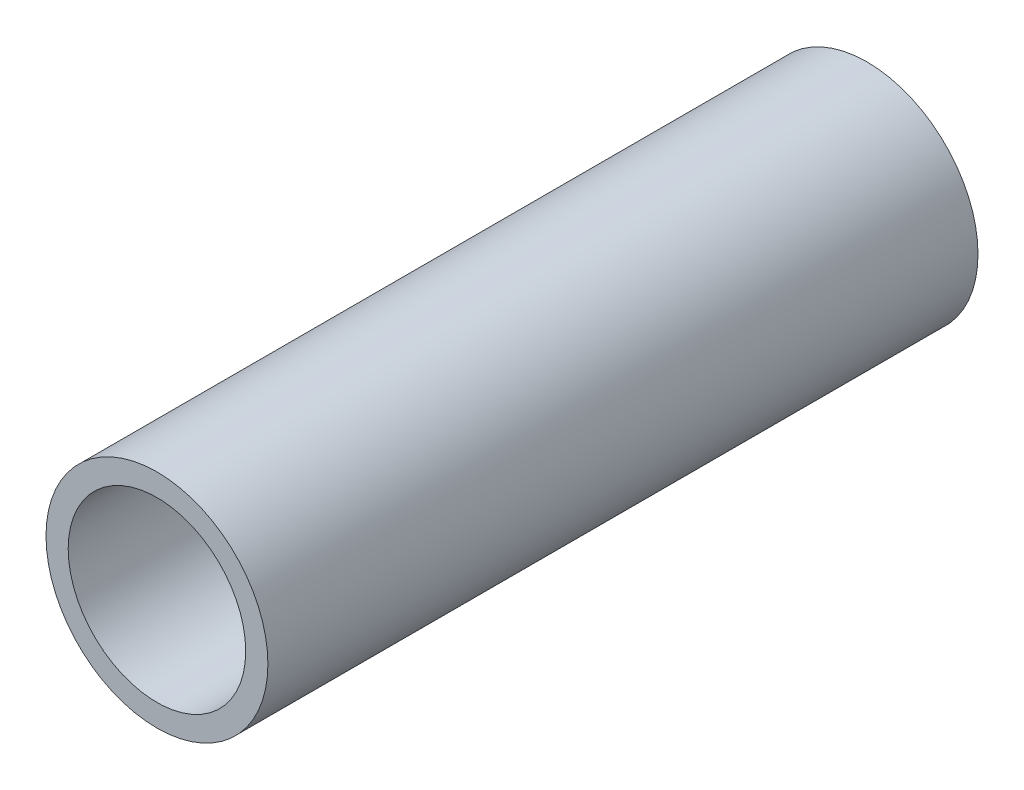
ISO-10303-21;
HEADER;
FILE_DESCRIPTION(('STEP AP214'),'2;1');
FILE_NAME('part.step','',(''),(''),'','','');
FILE_SCHEMA(('AUTOMOTIVE_DESIGN { 1 0 10303 214 1 1 1 1 }'));
ENDSEC;
DATA;
#1=APPLICATION_CONTEXT('core data for automotive mechanical design processes');
#2=APPLICATION_PROTOCOL_DEFINITION('international standard','automotive_design',2000,#1);
#3=PRODUCT_CONTEXT('',#1,'mechanical');
#4=PRODUCT('Part','Part','',(#3));
#5=PRODUCT_RELATED_PRODUCT_CATEGORY('part','',(#4));
#6=PRODUCT_DEFINITION_FORMATION('','',#4);
#7=PRODUCT_DEFINITION_CONTEXT('part definition',#1,'design');
#8=PRODUCT_DEFINITION('design','',#6,#7);
#9=PRODUCT_DEFINITION_SHAPE('','',#8);
#10=(LENGTH_UNIT() NAMED_UNIT(*) SI_UNIT(.MILLI.,.METRE.));
#11=(NAMED_UNIT(*) PLANE_ANGLE_UNIT() SI_UNIT($,.RADIAN.));
#12=(NAMED_UNIT(*) SI_UNIT($,.STERADIAN.) SOLID_ANGLE_UNIT());
#13=UNCERTAINTY_MEASURE_WITH_UNIT(LENGTH_MEASURE(1.E-05),#10,'distance_accuracy_value','');
#14=(GEOMETRIC_REPRESENTATION_CONTEXT(3) GLOBAL_UNCERTAINTY_ASSIGNED_CONTEXT((#13)) GLOBAL_UNIT_ASSIGNED_CONTEXT((#10,
#11,#12)) REPRESENTATION_CONTEXT('',''));
#15=CARTESIAN_POINT('',(0.,0.,0.));
#16=DIRECTION('',(0.,0.,1.));
#17=DIRECTION('',(1.,0.,0.));
#18=AXIS2_PLACEMENT_3D('',#15,#16,#17);
#19=CARTESIAN_POINT('',(0.,0.,25.4));
#20=DIRECTION('',(0.,0.,1.));
#21=DIRECTION('',(1.,0.,0.));
#22=AXIS2_PLACEMENT_3D('',#19,#20,#21);
#23=PLANE('',#22);
#24=CARTESIAN_POINT('',(0.,0.,25.4));
#25=DIRECTION('',(0.,0.,1.));
#26=DIRECTION('',(1.,0.,0.));
#27=AXIS2_PLACEMENT_3D('',#24,#25,#26);
#28=CIRCLE('',#27,3.96875);
#29=CARTESIAN_POINT('',(3.96875,0.,25.4));
#30=VERTEX_POINT('',#29);
#31=EDGE_CURVE('E10',#30,#30,#28,.T.);
#32=ORIENTED_EDGE('',*,*,#31,.T.);
#33=EDGE_LOOP('',(#32));
#34=FACE_BOUND('',#33,.T.);
#35=CARTESIAN_POINT('',(0.,0.,25.4));
#36=DIRECTION('',(0.,0.,1.));
#37=DIRECTION('',(1.,0.,0.));
#38=AXIS2_PLACEMENT_3D('',#35,#36,#37);
#39=CIRCLE('',#38,3.175);
#40=CARTESIAN_POINT('',(3.175,0.,25.4));
#41=VERTEX_POINT('',#40);
#42=EDGE_CURVE('E42',#41,#41,#39,.T.);
#43=ORIENTED_EDGE('',*,*,#42,.F.);
#44=EDGE_LOOP('',(#43));
#45=FACE_BOUND('',#44,.T.);
#46=ADVANCED_FACE('F31',(#34,#45),#23,.T.);
#47=CARTESIAN_POINT('',(0.,0.,0.));
#48=DIRECTION('',(0.,0.,1.));
#49=DIRECTION('',(1.,0.,0.));
#50=AXIS2_PLACEMENT_3D('',#47,#48,#49);
#51=PLANE('',#50);
#52=CARTESIAN_POINT('',(0.,0.,0.));
#53=DIRECTION('',(0.,0.,1.));
#54=DIRECTION('',(1.,0.,0.));
#55=AXIS2_PLACEMENT_3D('',#52,#53,#54);
#56=CIRCLE('',#55,3.96875);
#57=CARTESIAN_POINT('',(3.96875,0.,0.));
#58=VERTEX_POINT('',#57);
#59=EDGE_CURVE('E35',#58,#58,#56,.T.);
#60=ORIENTED_EDGE('',*,*,#59,.F.);
#61=EDGE_LOOP('',(#60));
#62=FACE_BOUND('',#61,.T.);
#63=CARTESIAN_POINT('',(0.,0.,0.));
#64=DIRECTION('',(0.,0.,1.));
#65=DIRECTION('',(1.,0.,0.));
#66=AXIS2_PLACEMENT_3D('',#63,#64,#65);
#67=CIRCLE('',#66,3.175);
#68=CARTESIAN_POINT('',(3.175,0.,0.));
#69=VERTEX_POINT('',#68);
#70=EDGE_CURVE('E44',#69,#69,#67,.T.);
#71=ORIENTED_EDGE('',*,*,#70,.T.);
#72=EDGE_LOOP('',(#71));
#73=FACE_BOUND('',#72,.T.);
#74=ADVANCED_FACE('F54',(#62,#73),#51,.F.);
#75=CARTESIAN_POINT('',(0.,0.,25.4));
#76=DIRECTION('',(0.,0.,-1.));
#77=DIRECTION('',(-1.,0.,0.));
#78=AXIS2_PLACEMENT_3D('',#75,#76,#77);
#79=CYLINDRICAL_SURFACE('',#78,3.96875);
#80=ORIENTED_EDGE('',*,*,#31,.F.);
#81=EDGE_LOOP('',(#80));
#82=FACE_BOUND('',#81,.T.);
#83=ORIENTED_EDGE('',*,*,#59,.T.);
#84=EDGE_LOOP('',(#83));
#85=FACE_BOUND('',#84,.T.);
#86=ADVANCED_FACE('F33',(#82,#85),#79,.T.);
#87=CARTESIAN_POINT('',(0.,0.,25.4));
#88=DIRECTION('',(0.,0.,-1.));
#89=DIRECTION('',(-1.,0.,0.));
#90=AXIS2_PLACEMENT_3D('',#87,#88,#89);
#91=CYLINDRICAL_SURFACE('',#90,3.175);
#92=ORIENTED_EDGE('',*,*,#42,.T.);
#93=EDGE_LOOP('',(#92));
#94=FACE_BOUND('',#93,.T.);
#95=ORIENTED_EDGE('',*,*,#70,.F.);
#96=EDGE_LOOP('',(#95));
#97=FACE_BOUND('',#96,.T.);
#98=ADVANCED_FACE('F50',(#94,#97),#91,.F.);
#99=CLOSED_SHELL('',(#46,#74,#86,#98));
#100=MANIFOLD_SOLID_BREP('B2',#99);
#101=ADVANCED_BREP_SHAPE_REPRESENTATION('',(#18,#100),#14);
#102=SHAPE_DEFINITION_REPRESENTATION(#9,#101);
ENDSEC;
END-ISO-10303-21;
